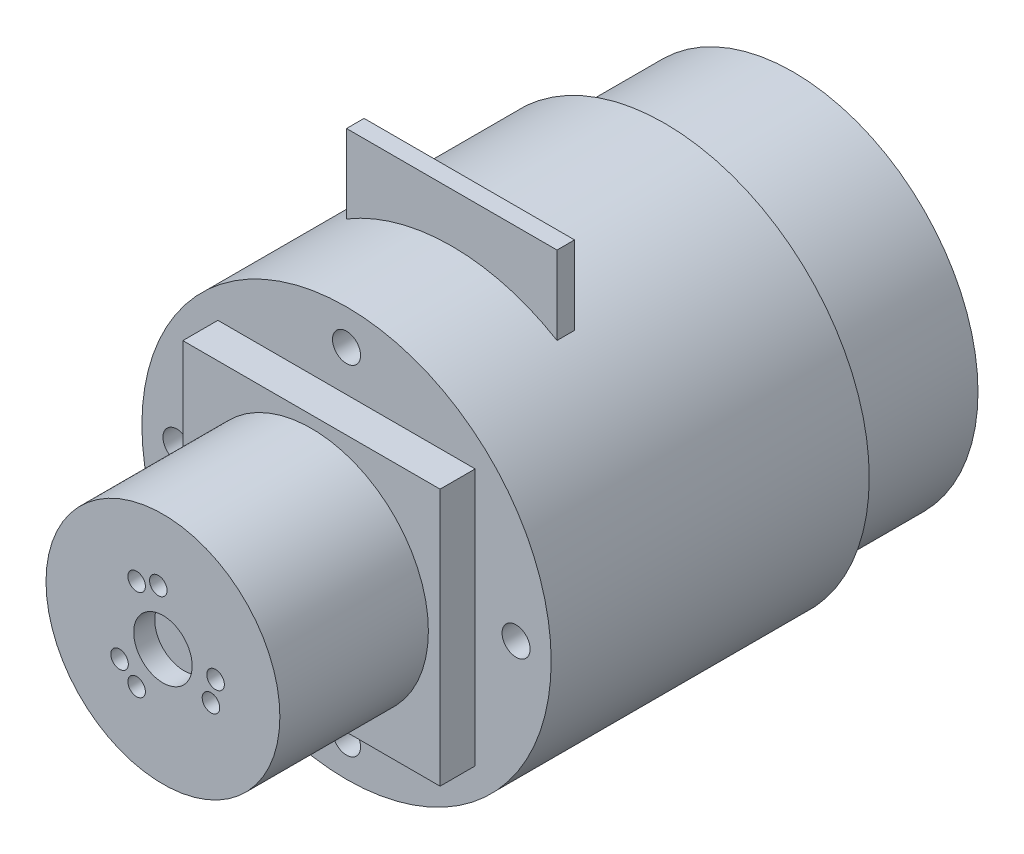
ISO-10303-21;
HEADER;
FILE_DESCRIPTION(('STEP AP214'),'2;1');
FILE_NAME('part.step','',(''),(''),'','','');
FILE_SCHEMA(('AUTOMOTIVE_DESIGN { 1 0 10303 214 1 1 1 1 }'));
ENDSEC;
DATA;
#1=APPLICATION_CONTEXT('core data for automotive mechanical design processes');
#2=APPLICATION_PROTOCOL_DEFINITION('international standard','automotive_design',2000,#1);
#3=PRODUCT_CONTEXT('',#1,'mechanical');
#4=PRODUCT('Part','Part','',(#3));
#5=PRODUCT_RELATED_PRODUCT_CATEGORY('part','',(#4));
#6=PRODUCT_DEFINITION_FORMATION('','',#4);
#7=PRODUCT_DEFINITION_CONTEXT('part definition',#1,'design');
#8=PRODUCT_DEFINITION('design','',#6,#7);
#9=PRODUCT_DEFINITION_SHAPE('','',#8);
#10=(LENGTH_UNIT() NAMED_UNIT(*) SI_UNIT(.MILLI.,.METRE.));
#11=(NAMED_UNIT(*) PLANE_ANGLE_UNIT() SI_UNIT($,.RADIAN.));
#12=(NAMED_UNIT(*) SI_UNIT($,.STERADIAN.) SOLID_ANGLE_UNIT());
#13=UNCERTAINTY_MEASURE_WITH_UNIT(LENGTH_MEASURE(1.E-05),#10,'distance_accuracy_value','');
#14=(GEOMETRIC_REPRESENTATION_CONTEXT(3) GLOBAL_UNCERTAINTY_ASSIGNED_CONTEXT((#13)) GLOBAL_UNIT_ASSIGNED_CONTEXT((#10,
#11,#12)) REPRESENTATION_CONTEXT('',''));
#15=CARTESIAN_POINT('',(0.,0.,0.));
#16=DIRECTION('',(0.,0.,1.));
#17=DIRECTION('',(1.,0.,0.));
#18=AXIS2_PLACEMENT_3D('',#15,#16,#17);
#19=CARTESIAN_POINT('',(0.,0.,27.2));
#20=DIRECTION('',(0.,0.,-1.));
#21=DIRECTION('',(-1.,0.,0.));
#22=AXIS2_PLACEMENT_3D('',#19,#20,#21);
#23=CYLINDRICAL_SURFACE('',#22,17.5);
#24=CARTESIAN_POINT('',(0.,0.,0.));
#25=DIRECTION('',(0.,0.,1.));
#26=DIRECTION('',(1.,0.,0.));
#27=AXIS2_PLACEMENT_3D('',#24,#25,#26);
#28=CIRCLE('',#27,17.5);
#29=CARTESIAN_POINT('',(17.5,0.,0.));
#30=VERTEX_POINT('',#29);
#31=EDGE_CURVE('E201',#30,#30,#28,.T.);
#32=ORIENTED_EDGE('',*,*,#31,.T.);
#33=EDGE_LOOP('',(#32));
#34=FACE_BOUND('',#33,.T.);
#35=CARTESIAN_POINT('',(0.,0.,27.2));
#36=DIRECTION('',(0.,0.,1.));
#37=DIRECTION('',(1.,0.,0.));
#38=AXIS2_PLACEMENT_3D('',#35,#36,#37);
#39=CIRCLE('',#38,17.5);
#40=CARTESIAN_POINT('',(17.5,0.,27.2));
#41=VERTEX_POINT('',#40);
#42=EDGE_CURVE('E202',#41,#41,#39,.T.);
#43=ORIENTED_EDGE('',*,*,#42,.F.);
#44=EDGE_LOOP('',(#43));
#45=FACE_BOUND('',#44,.T.);
#46=CARTESIAN_POINT('',(0.,0.,16.7));
#47=DIRECTION('',(0.,0.,-1.));
#48=DIRECTION('',(1.,0.,0.));
#49=AXIS2_PLACEMENT_3D('',#46,#47,#48);
#50=CIRCLE('',#49,17.5);
#51=CARTESIAN_POINT('',(-9.,15.0083310198036,16.7));
#52=VERTEX_POINT('',#51);
#53=CARTESIAN_POINT('',(9.00000000000021,15.0083310198035,16.7));
#54=VERTEX_POINT('',#53);
#55=EDGE_CURVE('E119',#52,#54,#50,.T.);
#56=ORIENTED_EDGE('',*,*,#55,.T.);
#57=DIRECTION('',(0.,0.,1.));
#58=VECTOR('',#57,1.);
#59=CARTESIAN_POINT('',(9.00000000000021,15.0083310198035,16.7));
#60=LINE('',#59,#58);
#61=CARTESIAN_POINT('',(9.00000000000021,15.0083310198035,18.2));
#62=VERTEX_POINT('',#61);
#63=EDGE_CURVE('E103',#54,#62,#60,.T.);
#64=ORIENTED_EDGE('',*,*,#63,.T.);
#65=CARTESIAN_POINT('',(0.,0.,18.2));
#66=DIRECTION('',(0.,0.,-1.));
#67=DIRECTION('',(1.,0.,0.));
#68=AXIS2_PLACEMENT_3D('',#65,#66,#67);
#69=CIRCLE('',#68,17.5);
#70=CARTESIAN_POINT('',(-9.,15.0083310198036,18.2));
#71=VERTEX_POINT('',#70);
#72=EDGE_CURVE('E135',#71,#62,#69,.T.);
#73=ORIENTED_EDGE('',*,*,#72,.F.);
#74=DIRECTION('',(0.,0.,1.));
#75=VECTOR('',#74,1.);
#76=CARTESIAN_POINT('',(-9.,15.0083310198036,16.7));
#77=LINE('',#76,#75);
#78=EDGE_CURVE('E125',#52,#71,#77,.T.);
#79=ORIENTED_EDGE('',*,*,#78,.F.);
#80=EDGE_LOOP('',(#56,#64,#73,#79));
#81=FACE_BOUND('',#80,.T.);
#82=ADVANCED_FACE('F36',(#34,#45,#81),#23,.T.);
#83=CARTESIAN_POINT('',(0.,0.,27.2));
#84=DIRECTION('',(0.,0.,1.));
#85=DIRECTION('',(1.,0.,0.));
#86=AXIS2_PLACEMENT_3D('',#83,#84,#85);
#87=PLANE('',#86);
#88=CARTESIAN_POINT('',(14.5,-1.51879438239676E-13,27.2));
#89=DIRECTION('',(0.,0.,1.));
#90=DIRECTION('',(1.,0.,0.));
#91=AXIS2_PLACEMENT_3D('',#88,#89,#90);
#92=CIRCLE('',#91,1.2);
#93=CARTESIAN_POINT('',(15.7,-1.51879438239676E-13,27.2));
#94=VERTEX_POINT('',#93);
#95=EDGE_CURVE('E141',#94,#94,#92,.T.);
#96=ORIENTED_EDGE('',*,*,#95,.F.);
#97=EDGE_LOOP('',(#96));
#98=FACE_BOUND('',#97,.T.);
#99=CARTESIAN_POINT('',(1.01252958826451E-13,14.5,27.2));
#100=DIRECTION('',(0.,0.,1.));
#101=DIRECTION('',(1.,0.,0.));
#102=AXIS2_PLACEMENT_3D('',#99,#100,#101);
#103=CIRCLE('',#102,1.2);
#104=CARTESIAN_POINT('',(1.2000000000001,14.5,27.2));
#105=VERTEX_POINT('',#104);
#106=EDGE_CURVE('E148',#105,#105,#103,.T.);
#107=ORIENTED_EDGE('',*,*,#106,.F.);
#108=EDGE_LOOP('',(#107));
#109=FACE_BOUND('',#108,.T.);
#110=CARTESIAN_POINT('',(-14.5,0.,27.2));
#111=DIRECTION('',(0.,0.,1.));
#112=DIRECTION('',(1.,0.,0.));
#113=AXIS2_PLACEMENT_3D('',#110,#111,#112);
#114=CIRCLE('',#113,1.2);
#115=CARTESIAN_POINT('',(-13.3,0.,27.2));
#116=VERTEX_POINT('',#115);
#117=EDGE_CURVE('E154',#116,#116,#114,.T.);
#118=ORIENTED_EDGE('',*,*,#117,.F.);
#119=EDGE_LOOP('',(#118));
#120=FACE_BOUND('',#119,.T.);
#121=CARTESIAN_POINT('',(0.,-14.5,27.2));
#122=DIRECTION('',(0.,0.,1.));
#123=DIRECTION('',(1.,0.,0.));
#124=AXIS2_PLACEMENT_3D('',#121,#122,#123);
#125=CIRCLE('',#124,1.2);
#126=CARTESIAN_POINT('',(1.2,-14.5,27.2));
#127=VERTEX_POINT('',#126);
#128=EDGE_CURVE('E160',#127,#127,#125,.T.);
#129=ORIENTED_EDGE('',*,*,#128,.F.);
#130=EDGE_LOOP('',(#129));
#131=FACE_BOUND('',#130,.T.);
#132=ORIENTED_EDGE('',*,*,#42,.T.);
#133=EDGE_LOOP('',(#132));
#134=FACE_BOUND('',#133,.T.);
#135=DIRECTION('',(1.,0.,0.));
#136=VECTOR('',#135,1.);
#137=CARTESIAN_POINT('',(11.,-11.,27.2));
#138=LINE('',#137,#136);
#139=CARTESIAN_POINT('',(-11.,-11.,27.2));
#140=VERTEX_POINT('',#139);
#141=CARTESIAN_POINT('',(11.,-11.,27.2));
#142=VERTEX_POINT('',#141);
#143=EDGE_CURVE('E185',#140,#142,#138,.T.);
#144=ORIENTED_EDGE('',*,*,#143,.F.);
#145=DIRECTION('',(0.,-1.,0.));
#146=VECTOR('',#145,1.);
#147=CARTESIAN_POINT('',(-11.,11.,27.2));
#148=LINE('',#147,#146);
#149=CARTESIAN_POINT('',(-11.,11.,27.2));
#150=VERTEX_POINT('',#149);
#151=EDGE_CURVE('E171',#150,#140,#148,.T.);
#152=ORIENTED_EDGE('',*,*,#151,.F.);
#153=DIRECTION('',(-1.,0.,0.));
#154=VECTOR('',#153,1.);
#155=CARTESIAN_POINT('',(11.,11.,27.2));
#156=LINE('',#155,#154);
#157=CARTESIAN_POINT('',(11.,11.,27.2));
#158=VERTEX_POINT('',#157);
#159=EDGE_CURVE('E176',#158,#150,#156,.T.);
#160=ORIENTED_EDGE('',*,*,#159,.F.);
#161=DIRECTION('',(0.,1.,0.));
#162=VECTOR('',#161,1.);
#163=CARTESIAN_POINT('',(11.,11.,27.2));
#164=LINE('',#163,#162);
#165=EDGE_CURVE('E187',#142,#158,#164,.T.);
#166=ORIENTED_EDGE('',*,*,#165,.F.);
#167=EDGE_LOOP('',(#144,#152,#160,#166));
#168=FACE_BOUND('',#167,.T.);
#169=ADVANCED_FACE('F214',(#98,#109,#120,#131,#134,#168),#87,.T.);
#170=CARTESIAN_POINT('',(0.,0.,0.));
#171=DIRECTION('',(0.,0.,1.));
#172=DIRECTION('',(1.,0.,0.));
#173=AXIS2_PLACEMENT_3D('',#170,#171,#172);
#174=PLANE('',#173);
#175=CARTESIAN_POINT('',(0.,0.,0.));
#176=DIRECTION('',(0.,0.,1.));
#177=DIRECTION('',(1.,0.,0.));
#178=AXIS2_PLACEMENT_3D('',#175,#176,#177);
#179=CIRCLE('',#178,15.8);
#180=CARTESIAN_POINT('',(15.8,0.,0.));
#181=VERTEX_POINT('',#180);
#182=EDGE_CURVE('E43',#181,#181,#179,.F.);
#183=ORIENTED_EDGE('',*,*,#182,.F.);
#184=EDGE_LOOP('',(#183));
#185=FACE_BOUND('',#184,.T.);
#186=ORIENTED_EDGE('',*,*,#31,.F.);
#187=EDGE_LOOP('',(#186));
#188=FACE_BOUND('',#187,.T.);
#189=ADVANCED_FACE('F211',(#185,#188),#174,.F.);
#190=CARTESIAN_POINT('',(0.,0.,-11.));
#191=DIRECTION('',(0.,0.,1.));
#192=DIRECTION('',(1.,0.,0.));
#193=AXIS2_PLACEMENT_3D('',#190,#191,#192);
#194=CYLINDRICAL_SURFACE('',#193,15.8);
#195=CARTESIAN_POINT('',(0.,0.,-11.));
#196=DIRECTION('',(0.,0.,-1.));
#197=DIRECTION('',(-1.,0.,0.));
#198=AXIS2_PLACEMENT_3D('',#195,#196,#197);
#199=CIRCLE('',#198,15.8);
#200=CARTESIAN_POINT('',(-15.8,0.,-11.));
#201=VERTEX_POINT('',#200);
#202=EDGE_CURVE('E198',#201,#201,#199,.T.);
#203=ORIENTED_EDGE('',*,*,#202,.F.);
#204=EDGE_LOOP('',(#203));
#205=FACE_BOUND('',#204,.T.);
#206=ORIENTED_EDGE('',*,*,#182,.T.);
#207=EDGE_LOOP('',(#206));
#208=FACE_BOUND('',#207,.T.);
#209=ADVANCED_FACE('F209',(#205,#208),#194,.T.);
#210=CARTESIAN_POINT('',(0.,0.,-11.));
#211=DIRECTION('',(0.,0.,-1.));
#212=DIRECTION('',(-1.,0.,0.));
#213=AXIS2_PLACEMENT_3D('',#210,#211,#212);
#214=PLANE('',#213);
#215=ORIENTED_EDGE('',*,*,#202,.T.);
#216=EDGE_LOOP('',(#215));
#217=FACE_BOUND('',#216,.T.);
#218=ADVANCED_FACE('F259',(#217),#214,.T.);
#219=CARTESIAN_POINT('',(-11.,11.,30.2));
#220=DIRECTION('',(1.,0.,0.));
#221=DIRECTION('',(0.,1.,0.));
#222=AXIS2_PLACEMENT_3D('',#219,#220,#221);
#223=PLANE('',#222);
#224=ORIENTED_EDGE('',*,*,#151,.T.);
#225=DIRECTION('',(0.,0.,-1.));
#226=VECTOR('',#225,1.);
#227=CARTESIAN_POINT('',(-11.,-11.,30.2));
#228=LINE('',#227,#226);
#229=CARTESIAN_POINT('',(-11.,-11.,30.2));
#230=VERTEX_POINT('',#229);
#231=EDGE_CURVE('E196',#230,#140,#228,.T.);
#232=ORIENTED_EDGE('',*,*,#231,.F.);
#233=DIRECTION('',(0.,-1.,0.));
#234=VECTOR('',#233,1.);
#235=CARTESIAN_POINT('',(-11.,11.,30.2));
#236=LINE('',#235,#234);
#237=CARTESIAN_POINT('',(-11.,11.,30.2));
#238=VERTEX_POINT('',#237);
#239=EDGE_CURVE('E172',#238,#230,#236,.T.);
#240=ORIENTED_EDGE('',*,*,#239,.F.);
#241=DIRECTION('',(0.,0.,-1.));
#242=VECTOR('',#241,1.);
#243=CARTESIAN_POINT('',(-11.,11.,30.2));
#244=LINE('',#243,#242);
#245=EDGE_CURVE('E182',#238,#150,#244,.T.);
#246=ORIENTED_EDGE('',*,*,#245,.T.);
#247=EDGE_LOOP('',(#224,#232,#240,#246));
#248=FACE_BOUND('',#247,.T.);
#249=ADVANCED_FACE('F241',(#248),#223,.F.);
#250=CARTESIAN_POINT('',(11.,-11.,30.2));
#251=DIRECTION('',(0.,1.,0.));
#252=DIRECTION('',(-1.,0.,0.));
#253=AXIS2_PLACEMENT_3D('',#250,#251,#252);
#254=PLANE('',#253);
#255=ORIENTED_EDGE('',*,*,#143,.T.);
#256=DIRECTION('',(0.,0.,-1.));
#257=VECTOR('',#256,1.);
#258=CARTESIAN_POINT('',(11.,-11.,30.2));
#259=LINE('',#258,#257);
#260=CARTESIAN_POINT('',(11.,-11.,30.2));
#261=VERTEX_POINT('',#260);
#262=EDGE_CURVE('E193',#261,#142,#259,.T.);
#263=ORIENTED_EDGE('',*,*,#262,.F.);
#264=DIRECTION('',(1.,0.,0.));
#265=VECTOR('',#264,1.);
#266=CARTESIAN_POINT('',(11.,-11.,30.2));
#267=LINE('',#266,#265);
#268=EDGE_CURVE('E175',#230,#261,#267,.T.);
#269=ORIENTED_EDGE('',*,*,#268,.F.);
#270=ORIENTED_EDGE('',*,*,#231,.T.);
#271=EDGE_LOOP('',(#255,#263,#269,#270));
#272=FACE_BOUND('',#271,.T.);
#273=ADVANCED_FACE('F231',(#272),#254,.F.);
#274=CARTESIAN_POINT('',(11.,11.,30.2));
#275=DIRECTION('',(-1.,0.,0.));
#276=DIRECTION('',(0.,-1.,0.));
#277=AXIS2_PLACEMENT_3D('',#274,#275,#276);
#278=PLANE('',#277);
#279=ORIENTED_EDGE('',*,*,#165,.T.);
#280=DIRECTION('',(0.,0.,-1.));
#281=VECTOR('',#280,1.);
#282=CARTESIAN_POINT('',(11.,11.,30.2));
#283=LINE('',#282,#281);
#284=CARTESIAN_POINT('',(11.,11.,30.2));
#285=VERTEX_POINT('',#284);
#286=EDGE_CURVE('E58',#285,#158,#283,.T.);
#287=ORIENTED_EDGE('',*,*,#286,.F.);
#288=DIRECTION('',(0.,1.,0.));
#289=VECTOR('',#288,1.);
#290=CARTESIAN_POINT('',(11.,11.,30.2));
#291=LINE('',#290,#289);
#292=EDGE_CURVE('E178',#261,#285,#291,.T.);
#293=ORIENTED_EDGE('',*,*,#292,.F.);
#294=ORIENTED_EDGE('',*,*,#262,.T.);
#295=EDGE_LOOP('',(#279,#287,#293,#294));
#296=FACE_BOUND('',#295,.T.);
#297=ADVANCED_FACE('F235',(#296),#278,.F.);
#298=CARTESIAN_POINT('',(11.,11.,30.2));
#299=DIRECTION('',(0.,-1.,0.));
#300=DIRECTION('',(1.,0.,0.));
#301=AXIS2_PLACEMENT_3D('',#298,#299,#300);
#302=PLANE('',#301);
#303=ORIENTED_EDGE('',*,*,#159,.T.);
#304=ORIENTED_EDGE('',*,*,#245,.F.);
#305=DIRECTION('',(-1.,0.,0.));
#306=VECTOR('',#305,1.);
#307=CARTESIAN_POINT('',(11.,11.,30.2));
#308=LINE('',#307,#306);
#309=EDGE_CURVE('E180',#285,#238,#308,.T.);
#310=ORIENTED_EDGE('',*,*,#309,.F.);
#311=ORIENTED_EDGE('',*,*,#286,.T.);
#312=EDGE_LOOP('',(#303,#304,#310,#311));
#313=FACE_BOUND('',#312,.T.);
#314=ADVANCED_FACE('F242',(#313),#302,.F.);
#315=CARTESIAN_POINT('',(0.,0.,30.2));
#316=DIRECTION('',(0.,0.,-1.));
#317=DIRECTION('',(-1.,0.,0.));
#318=AXIS2_PLACEMENT_3D('',#315,#316,#317);
#319=PLANE('',#318);
#320=CARTESIAN_POINT('',(0.,0.,30.2));
#321=DIRECTION('',(0.,0.,-1.));
#322=DIRECTION('',(-1.,0.,0.));
#323=AXIS2_PLACEMENT_3D('',#320,#321,#322);
#324=CIRCLE('',#323,10.);
#325=CARTESIAN_POINT('',(-10.,0.,30.2));
#326=VERTEX_POINT('',#325);
#327=EDGE_CURVE('E11',#326,#326,#324,.F.);
#328=ORIENTED_EDGE('',*,*,#327,.F.);
#329=EDGE_LOOP('',(#328));
#330=FACE_BOUND('',#329,.T.);
#331=ORIENTED_EDGE('',*,*,#239,.T.);
#332=ORIENTED_EDGE('',*,*,#268,.T.);
#333=ORIENTED_EDGE('',*,*,#292,.T.);
#334=ORIENTED_EDGE('',*,*,#309,.T.);
#335=EDGE_LOOP('',(#331,#332,#333,#334));
#336=FACE_BOUND('',#335,.T.);
#337=ADVANCED_FACE('F237',(#330,#336),#319,.F.);
#338=CARTESIAN_POINT('',(0.,0.,42.9));
#339=DIRECTION('',(0.,0.,-1.));
#340=DIRECTION('',(-1.,0.,0.));
#341=AXIS2_PLACEMENT_3D('',#338,#339,#340);
#342=CYLINDRICAL_SURFACE('',#341,10.);
#343=CARTESIAN_POINT('',(0.,0.,42.9));
#344=DIRECTION('',(0.,0.,1.));
#345=DIRECTION('',(1.,0.,0.));
#346=AXIS2_PLACEMENT_3D('',#343,#344,#345);
#347=CIRCLE('',#346,10.);
#348=CARTESIAN_POINT('',(10.,0.,42.9));
#349=VERTEX_POINT('',#348);
#350=EDGE_CURVE('E166',#349,#349,#347,.T.);
#351=ORIENTED_EDGE('',*,*,#350,.F.);
#352=EDGE_LOOP('',(#351));
#353=FACE_BOUND('',#352,.T.);
#354=ORIENTED_EDGE('',*,*,#327,.T.);
#355=EDGE_LOOP('',(#354));
#356=FACE_BOUND('',#355,.T.);
#357=ADVANCED_FACE('F249',(#353,#356),#342,.T.);
#358=CARTESIAN_POINT('',(0.,0.,42.9));
#359=DIRECTION('',(0.,0.,1.));
#360=DIRECTION('',(1.,0.,0.));
#361=AXIS2_PLACEMENT_3D('',#358,#359,#360);
#362=PLANE('',#361);
#363=CARTESIAN_POINT('',(-0.394899144077768,4.51371787112511,42.9));
#364=DIRECTION('',(0.,0.,1.));
#365=DIRECTION('',(1.,0.,0.));
#366=AXIS2_PLACEMENT_3D('',#363,#364,#365);
#367=CIRCLE('',#366,0.75);
#368=CARTESIAN_POINT('',(0.355100855922231,4.51371787112511,42.9));
#369=VERTEX_POINT('',#368);
#370=EDGE_CURVE('E600',#369,#369,#367,.T.);
#371=ORIENTED_EDGE('',*,*,#370,.F.);
#372=EDGE_LOOP('',(#371));
#373=FACE_BOUND('',#372,.T.);
#374=CARTESIAN_POINT('',(-2.24999999999996,3.89711431702999,42.9));
#375=DIRECTION('',(0.,0.,1.));
#376=DIRECTION('',(1.,0.,0.));
#377=AXIS2_PLACEMENT_3D('',#374,#375,#376);
#378=CIRCLE('',#377,0.749999999999999);
#379=CARTESIAN_POINT('',(-1.49999999999996,3.89711431702999,42.9));
#380=VERTEX_POINT('',#379);
#381=EDGE_CURVE('E599',#380,#380,#378,.T.);
#382=ORIENTED_EDGE('',*,*,#381,.F.);
#383=EDGE_LOOP('',(#382));
#384=FACE_BOUND('',#383,.T.);
#385=CARTESIAN_POINT('',(-3.71154476987127,-2.59885162626665,42.9));
#386=DIRECTION('',(0.,0.,1.));
#387=DIRECTION('',(1.,0.,0.));
#388=AXIS2_PLACEMENT_3D('',#385,#386,#387);
#389=CIRCLE('',#388,0.75);
#390=CARTESIAN_POINT('',(-2.96154476987127,-2.59885162626665,42.9));
#391=VERTEX_POINT('',#390);
#392=EDGE_CURVE('E609',#391,#391,#389,.T.);
#393=ORIENTED_EDGE('',*,*,#392,.F.);
#394=EDGE_LOOP('',(#393));
#395=FACE_BOUND('',#394,.T.);
#396=CARTESIAN_POINT('',(-2.25000000000002,-3.89711431702996,42.9));
#397=DIRECTION('',(0.,0.,1.));
#398=DIRECTION('',(1.,0.,0.));
#399=AXIS2_PLACEMENT_3D('',#396,#397,#398);
#400=CIRCLE('',#399,0.749999999999999);
#401=CARTESIAN_POINT('',(-1.50000000000002,-3.89711431702996,42.9));
#402=VERTEX_POINT('',#401);
#403=EDGE_CURVE('E614',#402,#402,#400,.T.);
#404=ORIENTED_EDGE('',*,*,#403,.F.);
#405=EDGE_LOOP('',(#404));
#406=FACE_BOUND('',#405,.T.);
#407=CARTESIAN_POINT('',(4.10644391394907,-1.91486624485844,42.9));
#408=DIRECTION('',(0.,0.,1.));
#409=DIRECTION('',(1.,0.,0.));
#410=AXIS2_PLACEMENT_3D('',#407,#408,#409);
#411=CIRCLE('',#410,0.749999999999999);
#412=CARTESIAN_POINT('',(4.85644391394907,-1.91486624485844,42.9));
#413=VERTEX_POINT('',#412);
#414=EDGE_CURVE('E620',#413,#413,#411,.T.);
#415=ORIENTED_EDGE('',*,*,#414,.F.);
#416=EDGE_LOOP('',(#415));
#417=FACE_BOUND('',#416,.T.);
#418=CARTESIAN_POINT('',(4.5,0.,42.9));
#419=DIRECTION('',(0.,0.,1.));
#420=DIRECTION('',(1.,0.,0.));
#421=AXIS2_PLACEMENT_3D('',#418,#419,#420);
#422=CIRCLE('',#421,0.749999999999999);
#423=CARTESIAN_POINT('',(5.25,0.,42.9));
#424=VERTEX_POINT('',#423);
#425=EDGE_CURVE('E626',#424,#424,#422,.T.);
#426=ORIENTED_EDGE('',*,*,#425,.F.);
#427=EDGE_LOOP('',(#426));
#428=FACE_BOUND('',#427,.T.);
#429=CARTESIAN_POINT('',(0.,0.,42.9));
#430=DIRECTION('',(0.,0.,1.));
#431=DIRECTION('',(1.,0.,0.));
#432=AXIS2_PLACEMENT_3D('',#429,#430,#431);
#433=CIRCLE('',#432,2.5);
#434=CARTESIAN_POINT('',(2.5,0.,42.9));
#435=VERTEX_POINT('',#434);
#436=EDGE_CURVE('E130',#435,#435,#433,.T.);
#437=ORIENTED_EDGE('',*,*,#436,.F.);
#438=EDGE_LOOP('',(#437));
#439=FACE_BOUND('',#438,.T.);
#440=ORIENTED_EDGE('',*,*,#350,.T.);
#441=EDGE_LOOP('',(#440));
#442=FACE_BOUND('',#441,.T.);
#443=ADVANCED_FACE('F305',(#373,#384,#395,#406,#417,#428,#439,#442),#362,.T.);
#444=CARTESIAN_POINT('',(0.,-14.5,17.2));
#445=DIRECTION('',(0.,0.,1.));
#446=DIRECTION('',(1.,0.,0.));
#447=AXIS2_PLACEMENT_3D('',#444,#445,#446);
#448=CYLINDRICAL_SURFACE('',#447,1.2);
#449=CARTESIAN_POINT('',(0.,-14.5,17.2));
#450=DIRECTION('',(0.,0.,1.));
#451=DIRECTION('',(1.,0.,0.));
#452=AXIS2_PLACEMENT_3D('',#449,#450,#451);
#453=CIRCLE('',#452,1.2);
#454=CARTESIAN_POINT('',(1.2,-14.5,17.2));
#455=VERTEX_POINT('',#454);
#456=EDGE_CURVE('E163',#455,#455,#453,.T.);
#457=ORIENTED_EDGE('',*,*,#456,.F.);
#458=EDGE_LOOP('',(#457));
#459=FACE_BOUND('',#458,.T.);
#460=ORIENTED_EDGE('',*,*,#128,.T.);
#461=EDGE_LOOP('',(#460));
#462=FACE_BOUND('',#461,.T.);
#463=ADVANCED_FACE('F319',(#459,#462),#448,.F.);
#464=CARTESIAN_POINT('',(0.,-14.5,17.2));
#465=DIRECTION('',(0.,0.,1.));
#466=DIRECTION('',(1.,0.,0.));
#467=AXIS2_PLACEMENT_3D('',#464,#465,#466);
#468=PLANE('',#467);
#469=ORIENTED_EDGE('',*,*,#456,.T.);
#470=EDGE_LOOP('',(#469));
#471=FACE_BOUND('',#470,.T.);
#472=ADVANCED_FACE('F324',(#471),#468,.T.);
#473=CARTESIAN_POINT('',(-14.5,0.,17.2));
#474=DIRECTION('',(0.,0.,1.));
#475=DIRECTION('',(1.,0.,0.));
#476=AXIS2_PLACEMENT_3D('',#473,#474,#475);
#477=CYLINDRICAL_SURFACE('',#476,1.2);
#478=CARTESIAN_POINT('',(-14.5,0.,17.2));
#479=DIRECTION('',(0.,0.,1.));
#480=DIRECTION('',(1.,0.,0.));
#481=AXIS2_PLACEMENT_3D('',#478,#479,#480);
#482=CIRCLE('',#481,1.2);
#483=CARTESIAN_POINT('',(-13.3,0.,17.2));
#484=VERTEX_POINT('',#483);
#485=EDGE_CURVE('E157',#484,#484,#482,.T.);
#486=ORIENTED_EDGE('',*,*,#485,.F.);
#487=EDGE_LOOP('',(#486));
#488=FACE_BOUND('',#487,.T.);
#489=ORIENTED_EDGE('',*,*,#117,.T.);
#490=EDGE_LOOP('',(#489));
#491=FACE_BOUND('',#490,.T.);
#492=ADVANCED_FACE('F334',(#488,#491),#477,.F.);
#493=CARTESIAN_POINT('',(-14.5,0.,17.2));
#494=DIRECTION('',(0.,0.,1.));
#495=DIRECTION('',(1.,0.,0.));
#496=AXIS2_PLACEMENT_3D('',#493,#494,#495);
#497=PLANE('',#496);
#498=ORIENTED_EDGE('',*,*,#485,.T.);
#499=EDGE_LOOP('',(#498));
#500=FACE_BOUND('',#499,.T.);
#501=ADVANCED_FACE('F344',(#500),#497,.T.);
#502=CARTESIAN_POINT('',(1.01252958826451E-13,14.5,17.2));
#503=DIRECTION('',(0.,0.,1.));
#504=DIRECTION('',(1.,0.,0.));
#505=AXIS2_PLACEMENT_3D('',#502,#503,#504);
#506=CYLINDRICAL_SURFACE('',#505,1.2);
#507=CARTESIAN_POINT('',(1.01252958826451E-13,14.5,17.2));
#508=DIRECTION('',(0.,0.,1.));
#509=DIRECTION('',(1.,0.,0.));
#510=AXIS2_PLACEMENT_3D('',#507,#508,#509);
#511=CIRCLE('',#510,1.2);
#512=CARTESIAN_POINT('',(1.2000000000001,14.5,17.2));
#513=VERTEX_POINT('',#512);
#514=EDGE_CURVE('E151',#513,#513,#511,.T.);
#515=ORIENTED_EDGE('',*,*,#514,.F.);
#516=EDGE_LOOP('',(#515));
#517=FACE_BOUND('',#516,.T.);
#518=ORIENTED_EDGE('',*,*,#106,.T.);
#519=EDGE_LOOP('',(#518));
#520=FACE_BOUND('',#519,.T.);
#521=ADVANCED_FACE('F354',(#517,#520),#506,.F.);
#522=CARTESIAN_POINT('',(1.01252958826451E-13,14.5,17.2));
#523=DIRECTION('',(0.,0.,1.));
#524=DIRECTION('',(1.,0.,0.));
#525=AXIS2_PLACEMENT_3D('',#522,#523,#524);
#526=PLANE('',#525);
#527=ORIENTED_EDGE('',*,*,#514,.T.);
#528=EDGE_LOOP('',(#527));
#529=FACE_BOUND('',#528,.T.);
#530=ADVANCED_FACE('F364',(#529),#526,.T.);
#531=CARTESIAN_POINT('',(14.5,-1.51879438239676E-13,17.2));
#532=DIRECTION('',(0.,0.,1.));
#533=DIRECTION('',(1.,0.,0.));
#534=AXIS2_PLACEMENT_3D('',#531,#532,#533);
#535=CYLINDRICAL_SURFACE('',#534,1.2);
#536=CARTESIAN_POINT('',(14.5,-1.51879438239676E-13,17.2));
#537=DIRECTION('',(0.,0.,1.));
#538=DIRECTION('',(1.,0.,0.));
#539=AXIS2_PLACEMENT_3D('',#536,#537,#538);
#540=CIRCLE('',#539,1.2);
#541=CARTESIAN_POINT('',(15.7,-1.51879438239676E-13,17.2));
#542=VERTEX_POINT('',#541);
#543=EDGE_CURVE('E145',#542,#542,#540,.T.);
#544=ORIENTED_EDGE('',*,*,#543,.F.);
#545=EDGE_LOOP('',(#544));
#546=FACE_BOUND('',#545,.T.);
#547=ORIENTED_EDGE('',*,*,#95,.T.);
#548=EDGE_LOOP('',(#547));
#549=FACE_BOUND('',#548,.T.);
#550=ADVANCED_FACE('F374',(#546,#549),#535,.F.);
#551=CARTESIAN_POINT('',(14.5,-1.51879438239676E-13,17.2));
#552=DIRECTION('',(0.,0.,1.));
#553=DIRECTION('',(1.,0.,0.));
#554=AXIS2_PLACEMENT_3D('',#551,#552,#553);
#555=PLANE('',#554);
#556=ORIENTED_EDGE('',*,*,#543,.T.);
#557=EDGE_LOOP('',(#556));
#558=FACE_BOUND('',#557,.T.);
#559=ADVANCED_FACE('F384',(#558),#555,.T.);
#560=CARTESIAN_POINT('',(-9.,15.0083310198036,16.7));
#561=DIRECTION('',(-1.,0.,0.));
#562=DIRECTION('',(0.,-1.,0.));
#563=AXIS2_PLACEMENT_3D('',#560,#561,#562);
#564=PLANE('',#563);
#565=DIRECTION('',(0.,-1.,0.));
#566=VECTOR('',#565,1.);
#567=CARTESIAN_POINT('',(-9.,15.0083310198036,18.2));
#568=LINE('',#567,#566);
#569=CARTESIAN_POINT('',(-9.,21.7083310198036,18.2));
#570=VERTEX_POINT('',#569);
#571=EDGE_CURVE('E50',#570,#71,#568,.T.);
#572=ORIENTED_EDGE('',*,*,#571,.F.);
#573=DIRECTION('',(0.,0.,1.));
#574=VECTOR('',#573,1.);
#575=CARTESIAN_POINT('',(-9.,21.7083310198036,16.7));
#576=LINE('',#575,#574);
#577=CARTESIAN_POINT('',(-9.,21.7083310198036,16.7));
#578=VERTEX_POINT('',#577);
#579=EDGE_CURVE('E142',#578,#570,#576,.T.);
#580=ORIENTED_EDGE('',*,*,#579,.F.);
#581=DIRECTION('',(0.,-1.,0.));
#582=VECTOR('',#581,1.);
#583=CARTESIAN_POINT('',(-9.,15.0083310198036,16.7));
#584=LINE('',#583,#582);
#585=EDGE_CURVE('E113',#578,#52,#584,.T.);
#586=ORIENTED_EDGE('',*,*,#585,.T.);
#587=ORIENTED_EDGE('',*,*,#78,.T.);
#588=EDGE_LOOP('',(#572,#580,#586,#587));
#589=FACE_BOUND('',#588,.T.);
#590=ADVANCED_FACE('F394',(#589),#564,.T.);
#591=CARTESIAN_POINT('',(-9.,21.7083310198036,16.7));
#592=DIRECTION('',(0.,1.,0.));
#593=DIRECTION('',(-1.,0.,0.));
#594=AXIS2_PLACEMENT_3D('',#591,#592,#593);
#595=PLANE('',#594);
#596=DIRECTION('',(-1.,0.,0.));
#597=VECTOR('',#596,1.);
#598=CARTESIAN_POINT('',(-9.,21.7083310198036,18.2));
#599=LINE('',#598,#597);
#600=CARTESIAN_POINT('',(9.0000000000003,21.7083310198035,18.2));
#601=VERTEX_POINT('',#600);
#602=EDGE_CURVE('E127',#601,#570,#599,.T.);
#603=ORIENTED_EDGE('',*,*,#602,.F.);
#604=DIRECTION('',(0.,0.,1.));
#605=VECTOR('',#604,1.);
#606=CARTESIAN_POINT('',(9.0000000000003,21.7083310198035,16.7));
#607=LINE('',#606,#605);
#608=CARTESIAN_POINT('',(9.0000000000003,21.7083310198035,16.7));
#609=VERTEX_POINT('',#608);
#610=EDGE_CURVE('E112',#609,#601,#607,.T.);
#611=ORIENTED_EDGE('',*,*,#610,.F.);
#612=DIRECTION('',(-1.,0.,0.));
#613=VECTOR('',#612,1.);
#614=CARTESIAN_POINT('',(-9.,21.7083310198036,16.7));
#615=LINE('',#614,#613);
#616=EDGE_CURVE('E122',#609,#578,#615,.T.);
#617=ORIENTED_EDGE('',*,*,#616,.T.);
#618=ORIENTED_EDGE('',*,*,#579,.T.);
#619=EDGE_LOOP('',(#603,#611,#617,#618));
#620=FACE_BOUND('',#619,.T.);
#621=ADVANCED_FACE('F410',(#620),#595,.T.);
#622=CARTESIAN_POINT('',(9.00000000000021,15.0083310198035,16.7));
#623=DIRECTION('',(1.,0.,0.));
#624=DIRECTION('',(0.,1.,0.));
#625=AXIS2_PLACEMENT_3D('',#622,#623,#624);
#626=PLANE('',#625);
#627=DIRECTION('',(0.,1.,0.));
#628=VECTOR('',#627,1.);
#629=CARTESIAN_POINT('',(9.00000000000021,15.0083310198035,18.2));
#630=LINE('',#629,#628);
#631=EDGE_CURVE('E108',#62,#601,#630,.T.);
#632=ORIENTED_EDGE('',*,*,#631,.F.);
#633=ORIENTED_EDGE('',*,*,#63,.F.);
#634=DIRECTION('',(0.,1.,0.));
#635=VECTOR('',#634,1.);
#636=CARTESIAN_POINT('',(9.00000000000021,15.0083310198035,16.7));
#637=LINE('',#636,#635);
#638=EDGE_CURVE('E106',#54,#609,#637,.T.);
#639=ORIENTED_EDGE('',*,*,#638,.T.);
#640=ORIENTED_EDGE('',*,*,#610,.T.);
#641=EDGE_LOOP('',(#632,#633,#639,#640));
#642=FACE_BOUND('',#641,.T.);
#643=ADVANCED_FACE('F105',(#642),#626,.T.);
#644=CARTESIAN_POINT('',(0.,0.,16.7));
#645=DIRECTION('',(0.,0.,1.));
#646=DIRECTION('',(1.,0.,0.));
#647=AXIS2_PLACEMENT_3D('',#644,#645,#646);
#648=PLANE('',#647);
#649=ORIENTED_EDGE('',*,*,#55,.F.);
#650=ORIENTED_EDGE('',*,*,#585,.F.);
#651=ORIENTED_EDGE('',*,*,#616,.F.);
#652=ORIENTED_EDGE('',*,*,#638,.F.);
#653=EDGE_LOOP('',(#649,#650,#651,#652));
#654=FACE_BOUND('',#653,.T.);
#655=ADVANCED_FACE('F117',(#654),#648,.F.);
#656=CARTESIAN_POINT('',(0.,0.,18.2));
#657=DIRECTION('',(0.,0.,1.));
#658=DIRECTION('',(1.,0.,0.));
#659=AXIS2_PLACEMENT_3D('',#656,#657,#658);
#660=PLANE('',#659);
#661=ORIENTED_EDGE('',*,*,#72,.T.);
#662=ORIENTED_EDGE('',*,*,#631,.T.);
#663=ORIENTED_EDGE('',*,*,#602,.T.);
#664=ORIENTED_EDGE('',*,*,#571,.T.);
#665=EDGE_LOOP('',(#661,#662,#663,#664));
#666=FACE_BOUND('',#665,.T.);
#667=ADVANCED_FACE('F437',(#666),#660,.T.);
#668=CARTESIAN_POINT('',(0.,0.,41.1));
#669=DIRECTION('',(0.,0.,1.));
#670=DIRECTION('',(1.,0.,0.));
#671=AXIS2_PLACEMENT_3D('',#668,#669,#670);
#672=CYLINDRICAL_SURFACE('',#671,2.5);
#673=CARTESIAN_POINT('',(0.,0.,41.1));
#674=DIRECTION('',(0.,0.,1.));
#675=DIRECTION('',(1.,0.,0.));
#676=AXIS2_PLACEMENT_3D('',#673,#674,#675);
#677=CIRCLE('',#676,2.5);
#678=CARTESIAN_POINT('',(2.5,0.,41.1));
#679=VERTEX_POINT('',#678);
#680=EDGE_CURVE('E137',#679,#679,#677,.T.);
#681=ORIENTED_EDGE('',*,*,#680,.F.);
#682=EDGE_LOOP('',(#681));
#683=FACE_BOUND('',#682,.T.);
#684=ORIENTED_EDGE('',*,*,#436,.T.);
#685=EDGE_LOOP('',(#684));
#686=FACE_BOUND('',#685,.T.);
#687=ADVANCED_FACE('F446',(#683,#686),#672,.F.);
#688=CARTESIAN_POINT('',(0.,0.,41.1));
#689=DIRECTION('',(0.,0.,1.));
#690=DIRECTION('',(1.,0.,0.));
#691=AXIS2_PLACEMENT_3D('',#688,#689,#690);
#692=PLANE('',#691);
#693=ORIENTED_EDGE('',*,*,#680,.T.);
#694=EDGE_LOOP('',(#693));
#695=FACE_BOUND('',#694,.T.);
#696=ADVANCED_FACE('F455',(#695),#692,.T.);
#697=CARTESIAN_POINT('',(4.5,0.,40.9));
#698=DIRECTION('',(0.,0.,1.));
#699=DIRECTION('',(1.,0.,0.));
#700=AXIS2_PLACEMENT_3D('',#697,#698,#699);
#701=CYLINDRICAL_SURFACE('',#700,0.749999999999999);
#702=CARTESIAN_POINT('',(4.5,0.,40.9));
#703=DIRECTION('',(0.,0.,1.));
#704=DIRECTION('',(1.,0.,0.));
#705=AXIS2_PLACEMENT_3D('',#702,#703,#704);
#706=CIRCLE('',#705,0.749999999999999);
#707=CARTESIAN_POINT('',(5.25,0.,40.9));
#708=VERTEX_POINT('',#707);
#709=EDGE_CURVE('E629',#708,#708,#706,.T.);
#710=ORIENTED_EDGE('',*,*,#709,.F.);
#711=EDGE_LOOP('',(#710));
#712=FACE_BOUND('',#711,.T.);
#713=ORIENTED_EDGE('',*,*,#425,.T.);
#714=EDGE_LOOP('',(#713));
#715=FACE_BOUND('',#714,.T.);
#716=ADVANCED_FACE('F465',(#712,#715),#701,.F.);
#717=CARTESIAN_POINT('',(4.5,0.,40.9));
#718=DIRECTION('',(0.,0.,1.));
#719=DIRECTION('',(1.,0.,0.));
#720=AXIS2_PLACEMENT_3D('',#717,#718,#719);
#721=PLANE('',#720);
#722=ORIENTED_EDGE('',*,*,#709,.T.);
#723=EDGE_LOOP('',(#722));
#724=FACE_BOUND('',#723,.T.);
#725=ADVANCED_FACE('F482',(#724),#721,.T.);
#726=CARTESIAN_POINT('',(4.10644391394907,-1.91486624485844,40.9));
#727=DIRECTION('',(0.,0.,1.));
#728=DIRECTION('',(1.,0.,0.));
#729=AXIS2_PLACEMENT_3D('',#726,#727,#728);
#730=CYLINDRICAL_SURFACE('',#729,0.749999999999999);
#731=CARTESIAN_POINT('',(4.10644391394907,-1.91486624485844,40.9));
#732=DIRECTION('',(0.,0.,1.));
#733=DIRECTION('',(1.,0.,0.));
#734=AXIS2_PLACEMENT_3D('',#731,#732,#733);
#735=CIRCLE('',#734,0.749999999999999);
#736=CARTESIAN_POINT('',(4.85644391394907,-1.91486624485844,40.9));
#737=VERTEX_POINT('',#736);
#738=EDGE_CURVE('E623',#737,#737,#735,.T.);
#739=ORIENTED_EDGE('',*,*,#738,.F.);
#740=EDGE_LOOP('',(#739));
#741=FACE_BOUND('',#740,.T.);
#742=ORIENTED_EDGE('',*,*,#414,.T.);
#743=EDGE_LOOP('',(#742));
#744=FACE_BOUND('',#743,.T.);
#745=ADVANCED_FACE('F492',(#741,#744),#730,.F.);
#746=CARTESIAN_POINT('',(4.10644391394907,-1.91486624485844,40.9));
#747=DIRECTION('',(0.,0.,1.));
#748=DIRECTION('',(1.,0.,0.));
#749=AXIS2_PLACEMENT_3D('',#746,#747,#748);
#750=PLANE('',#749);
#751=ORIENTED_EDGE('',*,*,#738,.T.);
#752=EDGE_LOOP('',(#751));
#753=FACE_BOUND('',#752,.T.);
#754=ADVANCED_FACE('F502',(#753),#750,.T.);
#755=CARTESIAN_POINT('',(-2.25000000000002,-3.89711431702996,40.9));
#756=DIRECTION('',(0.,0.,1.));
#757=DIRECTION('',(1.,0.,0.));
#758=AXIS2_PLACEMENT_3D('',#755,#756,#757);
#759=CYLINDRICAL_SURFACE('',#758,0.749999999999999);
#760=CARTESIAN_POINT('',(-2.25000000000002,-3.89711431702996,40.9));
#761=DIRECTION('',(0.,0.,1.));
#762=DIRECTION('',(1.,0.,0.));
#763=AXIS2_PLACEMENT_3D('',#760,#761,#762);
#764=CIRCLE('',#763,0.749999999999999);
#765=CARTESIAN_POINT('',(-1.50000000000002,-3.89711431702996,40.9));
#766=VERTEX_POINT('',#765);
#767=EDGE_CURVE('E617',#766,#766,#764,.T.);
#768=ORIENTED_EDGE('',*,*,#767,.F.);
#769=EDGE_LOOP('',(#768));
#770=FACE_BOUND('',#769,.T.);
#771=ORIENTED_EDGE('',*,*,#403,.T.);
#772=EDGE_LOOP('',(#771));
#773=FACE_BOUND('',#772,.T.);
#774=ADVANCED_FACE('F512',(#770,#773),#759,.F.);
#775=CARTESIAN_POINT('',(-2.25000000000002,-3.89711431702996,40.9));
#776=DIRECTION('',(0.,0.,1.));
#777=DIRECTION('',(1.,0.,0.));
#778=AXIS2_PLACEMENT_3D('',#775,#776,#777);
#779=PLANE('',#778);
#780=ORIENTED_EDGE('',*,*,#767,.T.);
#781=EDGE_LOOP('',(#780));
#782=FACE_BOUND('',#781,.T.);
#783=ADVANCED_FACE('F522',(#782),#779,.T.);
#784=CARTESIAN_POINT('',(-3.71154476987127,-2.59885162626665,40.9));
#785=DIRECTION('',(0.,0.,1.));
#786=DIRECTION('',(1.,0.,0.));
#787=AXIS2_PLACEMENT_3D('',#784,#785,#786);
#788=CYLINDRICAL_SURFACE('',#787,0.75);
#789=CARTESIAN_POINT('',(-3.71154476987127,-2.59885162626665,40.9));
#790=DIRECTION('',(0.,0.,1.));
#791=DIRECTION('',(1.,0.,0.));
#792=AXIS2_PLACEMENT_3D('',#789,#790,#791);
#793=CIRCLE('',#792,0.75);
#794=CARTESIAN_POINT('',(-2.96154476987127,-2.59885162626665,40.9));
#795=VERTEX_POINT('',#794);
#796=EDGE_CURVE('E611',#795,#795,#793,.T.);
#797=ORIENTED_EDGE('',*,*,#796,.F.);
#798=EDGE_LOOP('',(#797));
#799=FACE_BOUND('',#798,.T.);
#800=ORIENTED_EDGE('',*,*,#392,.T.);
#801=EDGE_LOOP('',(#800));
#802=FACE_BOUND('',#801,.T.);
#803=ADVANCED_FACE('F532',(#799,#802),#788,.F.);
#804=CARTESIAN_POINT('',(-3.71154476987127,-2.59885162626665,40.9));
#805=DIRECTION('',(0.,0.,1.));
#806=DIRECTION('',(1.,0.,0.));
#807=AXIS2_PLACEMENT_3D('',#804,#805,#806);
#808=PLANE('',#807);
#809=ORIENTED_EDGE('',*,*,#796,.T.);
#810=EDGE_LOOP('',(#809));
#811=FACE_BOUND('',#810,.T.);
#812=ADVANCED_FACE('F542',(#811),#808,.T.);
#813=CARTESIAN_POINT('',(-2.24999999999996,3.89711431702999,40.9));
#814=DIRECTION('',(0.,0.,1.));
#815=DIRECTION('',(1.,0.,0.));
#816=AXIS2_PLACEMENT_3D('',#813,#814,#815);
#817=CYLINDRICAL_SURFACE('',#816,0.749999999999999);
#818=CARTESIAN_POINT('',(-2.24999999999996,3.89711431702999,40.9));
#819=DIRECTION('',(0.,0.,1.));
#820=DIRECTION('',(1.,0.,0.));
#821=AXIS2_PLACEMENT_3D('',#818,#819,#820);
#822=CIRCLE('',#821,0.749999999999999);
#823=CARTESIAN_POINT('',(-1.49999999999996,3.89711431702999,40.9));
#824=VERTEX_POINT('',#823);
#825=EDGE_CURVE('E603',#824,#824,#822,.T.);
#826=ORIENTED_EDGE('',*,*,#825,.F.);
#827=EDGE_LOOP('',(#826));
#828=FACE_BOUND('',#827,.T.);
#829=ORIENTED_EDGE('',*,*,#381,.T.);
#830=EDGE_LOOP('',(#829));
#831=FACE_BOUND('',#830,.T.);
#832=ADVANCED_FACE('F552',(#828,#831),#817,.F.);
#833=CARTESIAN_POINT('',(-2.24999999999996,3.89711431702999,40.9));
#834=DIRECTION('',(0.,0.,1.));
#835=DIRECTION('',(1.,0.,0.));
#836=AXIS2_PLACEMENT_3D('',#833,#834,#835);
#837=PLANE('',#836);
#838=ORIENTED_EDGE('',*,*,#825,.T.);
#839=EDGE_LOOP('',(#838));
#840=FACE_BOUND('',#839,.T.);
#841=ADVANCED_FACE('F562',(#840),#837,.T.);
#842=CARTESIAN_POINT('',(-0.394899144077768,4.51371787112511,40.9));
#843=DIRECTION('',(0.,0.,1.));
#844=DIRECTION('',(1.,0.,0.));
#845=AXIS2_PLACEMENT_3D('',#842,#843,#844);
#846=CYLINDRICAL_SURFACE('',#845,0.75);
#847=CARTESIAN_POINT('',(-0.394899144077768,4.51371787112511,40.9));
#848=DIRECTION('',(0.,0.,1.));
#849=DIRECTION('',(1.,0.,0.));
#850=AXIS2_PLACEMENT_3D('',#847,#848,#849);
#851=CIRCLE('',#850,0.75);
#852=CARTESIAN_POINT('',(0.355100855922231,4.51371787112511,40.9));
#853=VERTEX_POINT('',#852);
#854=EDGE_CURVE('E598',#853,#853,#851,.T.);
#855=ORIENTED_EDGE('',*,*,#854,.F.);
#856=EDGE_LOOP('',(#855));
#857=FACE_BOUND('',#856,.T.);
#858=ORIENTED_EDGE('',*,*,#370,.T.);
#859=EDGE_LOOP('',(#858));
#860=FACE_BOUND('',#859,.T.);
#861=ADVANCED_FACE('F572',(#857,#860),#846,.F.);
#862=CARTESIAN_POINT('',(-0.394899144077768,4.51371787112511,40.9));
#863=DIRECTION('',(0.,0.,1.));
#864=DIRECTION('',(1.,0.,0.));
#865=AXIS2_PLACEMENT_3D('',#862,#863,#864);
#866=PLANE('',#865);
#867=ORIENTED_EDGE('',*,*,#854,.T.);
#868=EDGE_LOOP('',(#867));
#869=FACE_BOUND('',#868,.T.);
#870=ADVANCED_FACE('F582',(#869),#866,.T.);
#871=CLOSED_SHELL('',(#82,#169,#189,#209,#218,#249,#273,#297,#314,#337,#357,#443,#463,#472,#492,
#501,#521,#530,#550,#559,#590,#621,#643,#655,#667,#687,#696,#716,#725,#745,#754,#774,#783,#803,
#812,#832,#841,#861,#870));
#872=MANIFOLD_SOLID_BREP('B2',#871);
#873=ADVANCED_BREP_SHAPE_REPRESENTATION('',(#18,#872),#14);
#874=SHAPE_DEFINITION_REPRESENTATION(#9,#873);
ENDSEC;
END-ISO-10303-21;
